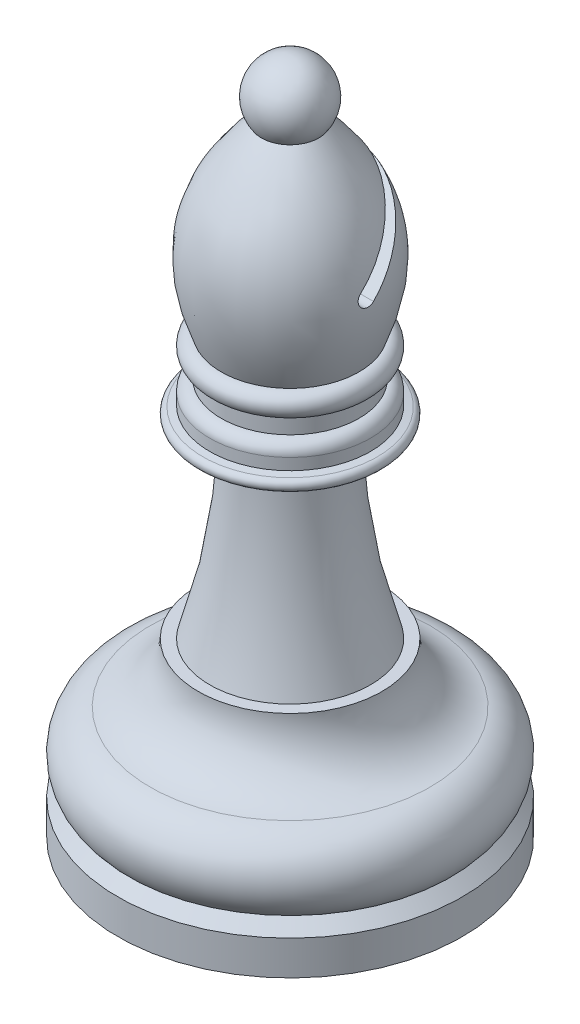
ISO-10303-21;
HEADER;
FILE_DESCRIPTION(('STEP AP214'),'2;1');
FILE_NAME('part.step','',(''),(''),'','','');
FILE_SCHEMA(('AUTOMOTIVE_DESIGN { 1 0 10303 214 1 1 1 1 }'));
ENDSEC;
DATA;
#1=APPLICATION_CONTEXT('core data for automotive mechanical design processes');
#2=APPLICATION_PROTOCOL_DEFINITION('international standard','automotive_design',2000,#1);
#3=PRODUCT_CONTEXT('',#1,'mechanical');
#4=PRODUCT('Part','Part','',(#3));
#5=PRODUCT_RELATED_PRODUCT_CATEGORY('part','',(#4));
#6=PRODUCT_DEFINITION_FORMATION('','',#4);
#7=PRODUCT_DEFINITION_CONTEXT('part definition',#1,'design');
#8=PRODUCT_DEFINITION('design','',#6,#7);
#9=PRODUCT_DEFINITION_SHAPE('','',#8);
#10=(LENGTH_UNIT() NAMED_UNIT(*) SI_UNIT(.MILLI.,.METRE.));
#11=(NAMED_UNIT(*) PLANE_ANGLE_UNIT() SI_UNIT($,.RADIAN.));
#12=(NAMED_UNIT(*) SI_UNIT($,.STERADIAN.) SOLID_ANGLE_UNIT());
#13=UNCERTAINTY_MEASURE_WITH_UNIT(LENGTH_MEASURE(1.E-05),#10,'distance_accuracy_value','');
#14=(GEOMETRIC_REPRESENTATION_CONTEXT(3) GLOBAL_UNCERTAINTY_ASSIGNED_CONTEXT((#13)) GLOBAL_UNIT_ASSIGNED_CONTEXT((#10,
#11,#12)) REPRESENTATION_CONTEXT('',''));
#15=CARTESIAN_POINT('',(0.,0.,0.));
#16=DIRECTION('',(0.,0.,1.));
#17=DIRECTION('',(1.,0.,0.));
#18=AXIS2_PLACEMENT_3D('',#15,#16,#17);
#19=CARTESIAN_POINT('',(0.,38.1,-6.));
#20=CARTESIAN_POINT('',(0.,44.6134056664983,-8.60950961383052));
#21=CARTESIAN_POINT('',(0.,49.2293830972762,-7.04536591565697));
#22=CARTESIAN_POINT('',(0.,54.,-2.5));
#23=B_SPLINE_CURVE_WITH_KNOTS('',3,(#19,#20,#21,#22),.UNSPECIFIED.,.F.,.F.,(4,4),(0.,1.),.UNSPECIFIED.);
#24=CARTESIAN_POINT('',(0.,0.,0.));
#25=DIRECTION('',(0.,-1.,0.));
#26=AXIS1_PLACEMENT('',#24,#25);
#27=SURFACE_OF_REVOLUTION('',#23,#26);
#28=CARTESIAN_POINT('',(0.,38.1,0.));
#29=DIRECTION('',(0.,-1.,0.));
#30=DIRECTION('',(0.,0.,-1.));
#31=AXIS2_PLACEMENT_3D('',#28,#29,#30);
#32=CIRCLE('',#31,6.);
#33=CARTESIAN_POINT('',(0.,38.1,-6.));
#34=VERTEX_POINT('',#33);
#35=EDGE_CURVE('E116',#34,#34,#32,.T.);
#36=ORIENTED_EDGE('',*,*,#35,.F.);
#37=EDGE_LOOP('',(#36));
#38=FACE_BOUND('',#37,.T.);
#39=CARTESIAN_POINT('',(0.,54.,0.));
#40=DIRECTION('',(0.,-1.,0.));
#41=DIRECTION('',(0.,0.,-1.));
#42=AXIS2_PLACEMENT_3D('',#39,#40,#41);
#43=CIRCLE('',#42,2.5);
#44=CARTESIAN_POINT('',(0.,54.,-2.5));
#45=VERTEX_POINT('',#44);
#46=EDGE_CURVE('E118',#45,#45,#43,.T.);
#47=ORIENTED_EDGE('',*,*,#46,.T.);
#48=EDGE_LOOP('',(#47));
#49=FACE_BOUND('',#48,.T.);
#50=CARTESIAN_POINT('',(7.26248134356405,44.0534236256244,0.));
#51=CARTESIAN_POINT('',(7.26268663383542,44.0250428411717,0.028331419455781));
#52=CARTESIAN_POINT('',(7.2625993604992,43.9990993969831,0.059088254775991));
#53=CARTESIAN_POINT('',(7.26179780040763,43.9527169371868,0.124461663837178));
#54=CARTESIAN_POINT('',(7.26108402080263,43.932273486875,0.159075095921259));
#55=CARTESIAN_POINT('',(7.25898753180029,43.8974646124223,0.231236703108871));
#56=CARTESIAN_POINT('',(7.25760450451457,43.8831020827646,0.268786265742128));
#57=CARTESIAN_POINT('',(7.25416638193759,43.8608595613702,0.345720116972008));
#58=CARTESIAN_POINT('',(7.25211141447113,43.8529783376805,0.385104055389834));
#59=CARTESIAN_POINT('',(7.24735942842652,43.8438983460937,0.464633910232364));
#60=CARTESIAN_POINT('',(7.24466180939577,43.8427058534499,0.504780506758731));
#61=CARTESIAN_POINT('',(7.23869750781927,43.847032307198,0.584668112911014));
#62=CARTESIAN_POINT('',(7.23543079735108,43.8525515829822,0.624409102534517));
#63=CARTESIAN_POINT('',(7.22842013648554,43.8701700569002,0.702566733714742));
#64=CARTESIAN_POINT('',(7.22467392792155,43.8823013366499,0.740975939002373));
#65=CARTESIAN_POINT('',(7.21685966880425,43.9128064056345,0.815191746093838));
#66=CARTESIAN_POINT('',(7.21279162702035,43.9311800248211,0.850998418761318));
#67=CARTESIAN_POINT('',(7.20447379495777,43.9737810095582,0.919233381166376));
#68=CARTESIAN_POINT('',(7.20022302991095,43.9980441465891,0.951639223091765));
#69=CARTESIAN_POINT('',(7.1917465898976,44.0516805558633,1.01190890703249));
#70=CARTESIAN_POINT('',(7.18752091612643,44.0810540695797,1.03977253430071));
#71=CARTESIAN_POINT('',(7.17926859945703,44.1441784558356,1.09023984812287));
#72=CARTESIAN_POINT('',(7.1752425397874,44.177941218614,1.112828763262));
#73=CARTESIAN_POINT('',(7.16757913028578,44.2488314962614,1.15199338980014));
#74=CARTESIAN_POINT('',(7.16394177328825,44.2859589490808,1.1685692120608));
#75=CARTESIAN_POINT('',(7.1572223757147,44.3623995012444,1.19517073644162));
#76=CARTESIAN_POINT('',(7.15413853036127,44.4017049294252,1.2052180170387));
#77=CARTESIAN_POINT('',(7.14863393273076,44.4814909415054,1.21853857435527));
#78=CARTESIAN_POINT('',(7.14621312317394,44.5219714235574,1.22181243639132));
#79=CARTESIAN_POINT('',(7.14213152634013,44.6026564791178,1.2214734863025));
#80=CARTESIAN_POINT('',(7.14046552485254,44.6428609953538,1.21790883988743));
#81=CARTESIAN_POINT('',(7.13790690272935,44.7221242377061,1.20407320865411));
#82=CARTESIAN_POINT('',(7.13701422478485,44.7611830485204,1.19380272088646));
#83=CARTESIAN_POINT('',(7.13599887231023,44.8368480551216,1.16691231879338));
#84=CARTESIAN_POINT('',(7.1358726487222,44.8734647776656,1.15032204852436));
#85=CARTESIAN_POINT('',(7.13633708154378,44.9433742202534,1.11126514820531));
#86=CARTESIAN_POINT('',(7.13692667867331,44.9766717732164,1.08880723971545));
#87=CARTESIAN_POINT('',(7.13812749857438,45.0178979654237,1.05566922974833));
#88=CARTESIAN_POINT('',(7.13845434261494,45.0277519316426,1.04729750408276));
#89=CARTESIAN_POINT('',(7.13917082058116,45.0469745631156,1.03004864288283));
#90=CARTESIAN_POINT('',(7.13956034705468,45.05634402324,1.02117238877427));
#91=CARTESIAN_POINT('',(7.1399799098201,45.0654705375734,1.01204691194898));
#92=B_SPLINE_CURVE_WITH_KNOTS('',3,(#50,#51,#52,#53,#54,#55,#56,#57,#58,#59,#60,#61,#62,#63,#64,
#65,#66,#67,#68,#69,#70,#71,#72,#73,#74,#75,#76,#77,#78,#79,#80,#81,#82,#83,#84,#85,#86,#87,#88,
#89,#90,#91),.UNSPECIFIED.,.F.,.F.,(4,2,2,2,2,2,2,2,2,2,2,2,2,2,2,2,2,2,2,2,4),(0.,
0.120146790619223,0.240196413255299,0.360303114751132,0.480386981337186,0.600583489733851,
0.720785897228578,0.841576790245981,0.962364393048281,1.08390484135041,1.20545103418418,
1.32733363124541,1.44921398107823,1.57068940836721,1.69215433806956,1.81276689302205,
1.9333705089415,2.05341524273187,2.17328254920591,2.21207154221718,2.25079473673644),.UNSPECIFIED.);
#93=CARTESIAN_POINT('',(7.26248134356405,44.0534236256244,0.));
#94=VERTEX_POINT('',#93);
#95=CARTESIAN_POINT('',(7.1399799098201,45.0654705375734,1.01204691194897));
#96=VERTEX_POINT('',#95);
#97=EDGE_CURVE('E69',#94,#96,#92,.T.);
#98=ORIENTED_EDGE('',*,*,#97,.T.);
#99=CARTESIAN_POINT('',(7.1399799098201,45.0654705375734,1.01204691194897));
#100=CARTESIAN_POINT('',(7.14838718721668,45.2475551994041,0.829962250118293));
#101=CARTESIAN_POINT('',(7.14534242337903,45.4299010166278,0.647616432894633));
#102=CARTESIAN_POINT('',(7.11650198899266,45.7936890041154,0.283828445406954));
#103=CARTESIAN_POINT('',(7.09070659768174,45.9751311854431,0.10238626407933));
#104=CARTESIAN_POINT('',(7.01655329463673,46.3355203243476,-0.258002874825186));
#105=CARTESIAN_POINT('',(6.96821670172983,46.5144694754233,-0.436952025900956));
#106=CARTESIAN_POINT('',(6.84937898158253,46.868640181314,-0.791122731791634));
#107=CARTESIAN_POINT('',(6.77887921650638,47.0438619645092,-0.966344514986769));
#108=CARTESIAN_POINT('',(6.62002788504419,47.3811919163433,-1.30367446682095));
#109=CARTESIAN_POINT('',(6.53265652269149,47.5435312986554,-1.46601384913303));
#110=CARTESIAN_POINT('',(6.33876888616723,47.8624835539578,-1.78496610443542));
#111=CARTESIAN_POINT('',(6.23224373089119,48.0190937297556,-1.94157628023319));
#112=CARTESIAN_POINT('',(6.00067312733628,48.3253831657134,-2.24786571619104));
#113=CARTESIAN_POINT('',(5.87562144586962,48.4750600708634,-2.39754262134104));
#114=CARTESIAN_POINT('',(5.60770821891917,48.7662173328409,-2.6886998833185));
#115=CARTESIAN_POINT('',(5.46484774475059,48.9076981819654,-2.83018073244301));
#116=CARTESIAN_POINT('',(5.163762225753,49.1796312267991,-3.10211377727673));
#117=CARTESIAN_POINT('',(5.00573257317453,49.3101914604504,-3.23267401092804));
#118=CARTESIAN_POINT('',(4.67367085539732,49.5607542405217,-3.48323679099935));
#119=CARTESIAN_POINT('',(4.49963741438778,49.6807558775036,-3.60323842798129));
#120=CARTESIAN_POINT('',(4.13665421465167,49.9085615176694,-3.831044068147));
#121=CARTESIAN_POINT('',(3.94772434626638,50.016381333477,-3.93886388395467));
#122=CARTESIAN_POINT('',(3.55579584794781,50.2183478423134,-4.14083039279106));
#123=CARTESIAN_POINT('',(3.35280246467963,50.3124995943304,-4.23498214480811));
#124=CARTESIAN_POINT('',(2.9891879835799,50.4626272142029,-4.38510976468059));
#125=CARTESIAN_POINT('',(2.83146415371097,50.5221308989607,-4.44461344943832));
#126=CARTESIAN_POINT('',(2.50980343241783,50.6320264906632,-4.55450904114086));
#127=CARTESIAN_POINT('',(2.34586795089689,50.682420450499,-4.60490300097666));
#128=CARTESIAN_POINT('',(2.01276179968953,50.7733467903807,-4.69582934085831));
#129=CARTESIAN_POINT('',(1.84359568198471,50.8138874873302,-4.73637003780787));
#130=CARTESIAN_POINT('',(1.5009295543641,50.8845055381128,-4.80698808859047));
#131=CARTESIAN_POINT('',(1.32742942272555,50.9145825977149,-4.8370651481926));
#132=CARTESIAN_POINT('',(0.976485697839069,50.9638449291659,-4.8863274796435));
#133=CARTESIAN_POINT('',(0.799027176707662,50.9829772436008,-4.90545979407841));
#134=CARTESIAN_POINT('',(0.442379687631089,51.0097483249955,-4.93223087547316));
#135=CARTESIAN_POINT('',(0.263190740003838,51.0173872267413,-4.93986977721893));
#136=CARTESIAN_POINT('',(-0.0954169813575829,51.0210148407701,-4.94349739124772));
#137=CARTESIAN_POINT('',(-0.274835747322854,51.0170039369948,-4.93948648747249));
#138=CARTESIAN_POINT('',(-0.632402544399132,50.9974149125931,-4.9198974630708));
#139=CARTESIAN_POINT('',(-0.810550588883745,50.9818369138855,-4.90431946436319));
#140=CARTESIAN_POINT('',(-1.15088942938791,50.9410176041595,-4.86350015463711));
#141=CARTESIAN_POINT('',(-1.31327648412099,50.9165869385956,-4.83906948907322));
#142=CARTESIAN_POINT('',(-1.63467407417452,50.8584964629644,-4.78097901344208));
#143=CARTESIAN_POINT('',(-1.79368522441342,50.8248383494822,-4.7473208999599));
#144=CARTESIAN_POINT('',(-2.10746118283643,50.7487839703908,-4.67126652086845));
#145=CARTESIAN_POINT('',(-2.26222611519591,50.7063879606197,-4.62887051109738));
#146=CARTESIAN_POINT('',(-2.5668109329149,50.6134059211095,-4.53588847158712));
#147=CARTESIAN_POINT('',(-2.71662803271197,50.5628153694881,-4.48529791996571));
#148=CARTESIAN_POINT('',(-3.17749717252343,50.3922722674444,-4.31475481792206));
#149=CARTESIAN_POINT('',(-3.47869061851698,50.258730808023,-4.18121335850069));
#150=CARTESIAN_POINT('',(-4.05095500292531,49.9625041172505,-3.8849866677281));
#151=CARTESIAN_POINT('',(-4.3219978470484,49.7997920673546,-3.72227461783221));
#152=CARTESIAN_POINT('',(-4.72425206597887,49.5235034219438,-3.44598597242149));
#153=CARTESIAN_POINT('',(-4.86653250220302,49.4178407366191,-3.34032328709671));
#154=CARTESIAN_POINT('',(-5.13927894118928,49.1993054971506,-3.12178804762825));
#155=CARTESIAN_POINT('',(-5.26975604891823,49.0864398939462,-3.00892244442382));
#156=CARTESIAN_POINT('',(-5.51869176506314,48.8541190658715,-2.7766016163491));
#157=CARTESIAN_POINT('',(-5.63713946562632,48.7346580093116,-2.65714055978927));
#158=CARTESIAN_POINT('',(-5.86150383468986,48.489947058955,-2.41242960943266));
#159=CARTESIAN_POINT('',(-5.96741680023112,48.3646954696641,-2.28717802014172));
#160=CARTESIAN_POINT('',(-6.17957294090977,48.0920490649462,-2.0145316154238));
#161=CARTESIAN_POINT('',(-6.28396671231052,47.9439327745007,-1.86641532497829));
#162=CARTESIAN_POINT('',(-6.4755236664415,47.6422282650678,-1.56471081554536));
#163=CARTESIAN_POINT('',(-6.56268580155887,47.4886397140589,-1.41112226453647));
#164=CARTESIAN_POINT('',(-6.71924972629945,47.1770416001728,-1.09952415065044));
#165=CARTESIAN_POINT('',(-6.78865631571417,47.019033244925,-0.941515795402596));
#166=CARTESIAN_POINT('',(-6.90929394128075,46.6996451608222,-0.622127711299819));
#167=CARTESIAN_POINT('',(-6.96052905917858,46.5382661977211,-0.460748748198722));
#168=CARTESIAN_POINT('',(-7.05830015864805,46.1596950068918,-0.0821775573693607));
#169=CARTESIAN_POINT('',(-7.09778094365204,45.9415601758607,0.135957273661748));
#170=CARTESIAN_POINT('',(-7.13218124919333,45.6133335387619,0.464183910760497));
#171=CARTESIAN_POINT('',(-7.13951402421507,45.5038153370225,0.573702112499927));
#172=CARTESIAN_POINT('',(-7.14593146297427,45.2846650017037,0.79285244781873));
#173=CARTESIAN_POINT('',(-7.14501664585485,45.1750328757296,0.902484573792824));
#174=CARTESIAN_POINT('',(-7.1399799098201,45.0654705375735,1.01204691194897));
#175=B_SPLINE_CURVE_WITH_KNOTS('',3,(#99,#100,#101,#102,#103,#104,#105,#106,#107,#108,#109,#110,
#111,#112,#113,#114,#115,#116,#117,#118,#119,#120,#121,#122,#123,#124,#125,#126,#127,#128,#129,
#130,#131,#132,#133,#134,#135,#136,#137,#138,#139,#140,#141,#142,#143,#144,#145,#146,#147,#148,
#149,#150,#151,#152,#153,#154,#155,#156,#157,#158,#159,#160,#161,#162,#163,#164,#165,#166,#167,
#168,#169,#170,#171,#172,#173,#174),.UNSPECIFIED.,.F.,.F.,(4,2,2,2,2,2,2,2,2,2,2,2,2,2,2,2,2,2,
2,2,2,2,2,2,2,2,2,2,2,2,2,2,2,2,2,2,2,4),(0.,0.772674150027272,1.5453388164993,2.31727419616838,
3.08916214141488,3.82523140792648,4.56164285445765,5.29830262920024,6.03491811041132,
6.76307016101677,7.49128486789059,8.21854318311233,8.94553162663503,9.48131838777722,
10.0169842575932,10.5521964020513,11.0874235951233,11.625219105941,12.163008309857,
12.7007797900976,13.2385456022303,13.7360564854443,14.2334759561565,14.7308808649165,
15.2285611908109,16.2907247576756,17.3538699001878,17.972341180176,18.5902243947428,
19.2086629738765,19.8272837959143,20.5286205296306,21.2299998886421,21.9311894455125,
22.6322213985798,23.5632247857868,24.0282077397182,24.4931614255902),.UNSPECIFIED.);
#176=CARTESIAN_POINT('',(-7.1399799098201,45.0654705375734,1.01204691194897));
#177=VERTEX_POINT('',#176);
#178=EDGE_CURVE('E11',#96,#177,#175,.T.);
#179=ORIENTED_EDGE('',*,*,#178,.T.);
#180=CARTESIAN_POINT('',(-7.1399799098201,45.0654705375734,1.01204691194897));
#181=CARTESIAN_POINT('',(-7.13867375830709,45.0371873836789,1.04037931057469));
#182=CARTESIAN_POINT('',(-7.13766473670743,45.0064799766659,1.06628956786351));
#183=CARTESIAN_POINT('',(-7.1363128017723,44.9411964267878,1.11263262541485));
#184=CARTESIAN_POINT('',(-7.1359694164194,44.9066230437867,1.13306929824798));
#185=CARTESIAN_POINT('',(-7.13601856049852,44.8345249992075,1.16788335785369));
#186=CARTESIAN_POINT('',(-7.13641148762617,44.7969987532229,1.18225746498806));
#187=CARTESIAN_POINT('',(-7.1379634388319,44.7200968902574,1.20453069009065));
#188=CARTESIAN_POINT('',(-7.13912228822421,44.6807216968722,1.21243128356902));
#189=CARTESIAN_POINT('',(-7.14219542962653,44.601268101322,1.22154309436843));
#190=CARTESIAN_POINT('',(-7.1441090805431,44.5611903234318,1.22275997546805));
#191=CARTESIAN_POINT('',(-7.14863965556428,44.4814314331836,1.2185036534181));
#192=CARTESIAN_POINT('',(-7.15125660988467,44.4417503379443,1.21303016279656));
#193=CARTESIAN_POINT('',(-7.15711135325733,44.3637576494735,1.19553636201952));
#194=CARTESIAN_POINT('',(-7.16035131925842,44.3254514344164,1.18349281516681));
#195=CARTESIAN_POINT('',(-7.16731623473637,44.2514257762034,1.15320330584934));
#196=CARTESIAN_POINT('',(-7.17104117045811,44.2157062597262,1.13495751927386));
#197=CARTESIAN_POINT('',(-7.17884661706416,44.1475956320092,1.09263795243648));
#198=CARTESIAN_POINT('',(-7.1829294403293,44.1152296440409,1.06852416231802));
#199=CARTESIAN_POINT('',(-7.19125027691519,44.055011115354,1.01521982597433));
#200=CARTESIAN_POINT('',(-7.19548829964669,44.027158848889,0.986028971490171));
#201=CARTESIAN_POINT('',(-7.20395850146631,43.9766053625575,0.923215322081625));
#202=CARTESIAN_POINT('',(-7.20819052308163,43.9539330164453,0.889569260284869));
#203=CARTESIAN_POINT('',(-7.21644399471168,43.9145799076678,0.818914770803875));
#204=CARTESIAN_POINT('',(-7.22046544473242,43.8978991448313,0.781906343215806));
#205=CARTESIAN_POINT('',(-7.22813280492595,43.8710182342581,0.70557782688519));
#206=CARTESIAN_POINT('',(-7.23177879780943,43.8608166566305,0.666258250284131));
#207=CARTESIAN_POINT('',(-7.23855927232342,43.8472002309236,0.58641953473591));
#208=CARTESIAN_POINT('',(-7.24169379172475,43.843784881493,0.545900484627662));
#209=CARTESIAN_POINT('',(-7.24733516756646,43.8438592241276,0.465041392184652));
#210=CARTESIAN_POINT('',(-7.24984526869875,43.8473123446094,0.424701541875099));
#211=CARTESIAN_POINT('',(-7.25419885472545,43.8609730595179,0.345145384704932));
#212=CARTESIAN_POINT('',(-7.25604239470537,43.8711800955946,0.30592898524757));
#213=CARTESIAN_POINT('',(-7.25903524219555,43.8979922997472,0.229957151990089));
#214=CARTESIAN_POINT('',(-7.26018809596523,43.9145640554558,0.193190023869726));
#215=CARTESIAN_POINT('',(-7.26183003806275,43.9536384923244,0.122977301401444));
#216=CARTESIAN_POINT('',(-7.26232011711179,43.9761322609406,0.0895268188254094));
#217=CARTESIAN_POINT('',(-7.26256299464039,44.0094001519591,0.0480504453189118));
#218=CARTESIAN_POINT('',(-7.26259013326639,44.0178441648932,0.0380955226001134));
#219=CARTESIAN_POINT('',(-7.26258187521037,44.035249019076,0.0186785597922273));
#220=CARTESIAN_POINT('',(-7.26254658413436,44.0442089627778,0.00921571517214043));
#221=CARTESIAN_POINT('',(-7.26248134356405,44.0534236256244,0.));
#222=B_SPLINE_CURVE_WITH_KNOTS('',3,(#180,#181,#182,#183,#184,#185,#186,#187,#188,#189,#190,
#191,#192,#193,#194,#195,#196,#197,#198,#199,#200,#201,#202,#203,#204,#205,#206,#207,#208,#209,
#210,#211,#212,#213,#214,#215,#216,#217,#218,#219,#220,#221),.UNSPECIFIED.,.F.,.F.,(4,2,2,2,2,2,
2,2,2,2,2,2,2,2,2,2,2,2,2,2,4),(0.,0.120007437315835,0.239929743520045,0.359916840591081,
0.479876581348775,0.59973465250772,0.719597873911052,0.839887797120201,0.960174309312853,
1.0813051572738,1.20244336238195,1.32424117702637,1.44603898818716,1.56780991044869,
1.6895718362106,1.81068716869586,1.93179248975782,2.05227055667731,2.17256833217398,
2.21171579517939,2.25079709968755),.UNSPECIFIED.);
#223=CARTESIAN_POINT('',(-7.26248134356405,44.0534236256244,0.));
#224=VERTEX_POINT('',#223);
#225=EDGE_CURVE('E46',#177,#224,#222,.T.);
#226=ORIENTED_EDGE('',*,*,#225,.T.);
#227=CARTESIAN_POINT('',(-7.26248134356405,44.0534236256244,0.));
#228=CARTESIAN_POINT('',(-7.261156953543,44.2457939440137,-0.19237031838932));
#229=CARTESIAN_POINT('',(-7.24744322879306,44.4381406156728,-0.384716990048377));
#230=CARTESIAN_POINT('',(-7.19517968497103,44.8212035764886,-0.767779950864221));
#231=CARTESIAN_POINT('',(-7.15662128451786,45.0119192792353,-0.958495653610856));
#232=CARTESIAN_POINT('',(-7.05457574782816,45.3901356300726,-1.33671200444817));
#233=CARTESIAN_POINT('',(-6.99107100539621,45.5776339096711,-1.5242102840467));
#234=CARTESIAN_POINT('',(-6.83939496446886,45.9475431290452,-1.89411950342079));
#235=CARTESIAN_POINT('',(-6.75122898007587,46.1299551555248,-2.07653152990036));
#236=CARTESIAN_POINT('',(-6.55985558656999,46.4716748069271,-2.4182511813027));
#237=CARTESIAN_POINT('',(-6.4587516050055,46.631572895905,-2.5781492702806));
#238=CARTESIAN_POINT('',(-6.23704193726552,46.9445389285707,-2.89111530294627));
#239=CARTESIAN_POINT('',(-6.11642981137006,47.0976045954846,-3.04418096986025));
#240=CARTESIAN_POINT('',(-5.85649062893772,47.3954025115118,-3.34197888588735));
#241=CARTESIAN_POINT('',(-5.71717931974984,47.5401416278028,-3.48671800217839));
#242=CARTESIAN_POINT('',(-5.42054649999131,47.8200728103777,-3.76664918475331));
#243=CARTESIAN_POINT('',(-5.26322683276622,47.9552658515167,-3.90184222589232));
#244=CARTESIAN_POINT('',(-4.94025672105069,48.2078530173603,-4.15442939173591));
#245=CARTESIAN_POINT('',(-4.77548745435735,48.3258104120274,-4.27238678640296));
#246=CARTESIAN_POINT('',(-4.43156800642927,48.5506300415713,-4.49720641594687));
#247=CARTESIAN_POINT('',(-4.25242498893377,48.6574977432834,-4.60407411765905));
#248=CARTESIAN_POINT('',(-3.88076284262928,48.8588919303423,-4.80546830471789));
#249=CARTESIAN_POINT('',(-3.68824485878692,48.9534194700813,-4.89999584445689));
#250=CARTESIAN_POINT('',(-3.29111120689039,49.1287869816479,-5.07536335602351));
#251=CARTESIAN_POINT('',(-3.08649713157591,49.2096287501424,-5.156205124518));
#252=CARTESIAN_POINT('',(-2.6873601299082,49.3490775853464,-5.29565395972203));
#253=CARTESIAN_POINT('',(-2.49381719717433,49.4090880581805,-5.35566443255616));
#254=CARTESIAN_POINT('',(-2.09960157255525,49.5159322284677,-5.46250860284336));
#255=CARTESIAN_POINT('',(-1.89893022365138,49.5627683932643,-5.5093447676399));
#256=CARTESIAN_POINT('',(-1.49230800805119,49.6424012903131,-5.5889776646887));
#257=CARTESIAN_POINT('',(-1.28636298100084,49.6752128954304,-5.62178926980602));
#258=CARTESIAN_POINT('',(-0.870888385840316,49.7262259178072,-5.67280229218278));
#259=CARTESIAN_POINT('',(-0.661359272811073,49.7444291760685,-5.69100555044411));
#260=CARTESIAN_POINT('',(-0.267218112922337,49.7645114367281,-5.71108781110378));
#261=CARTESIAN_POINT('',(-0.08278177966257,49.7681535602772,-5.71472993465279));
#262=CARTESIAN_POINT('',(0.285815851486273,49.7639327760944,-5.71050915047006));
#263=CARTESIAN_POINT('',(0.469977175121741,49.7560710230439,-5.70264739741954));
#264=CARTESIAN_POINT('',(0.836600129371235,49.7289711457949,-5.67554752017055));
#265=CARTESIAN_POINT('',(1.01906185740748,49.7097336777888,-5.65631005216443));
#266=CARTESIAN_POINT('',(1.38094916443063,49.6601835385089,-5.60675991288458));
#267=CARTESIAN_POINT('',(1.56037470074185,49.6298707116988,-5.57644708607438));
#268=CARTESIAN_POINT('',(1.90862206361809,49.5598873689602,-5.5064637433358));
#269=CARTESIAN_POINT('',(2.07759393821511,49.5205886543813,-5.46716502875697));
#270=CARTESIAN_POINT('',(2.4106244053921,49.4325873189082,-5.3791636932838));
#271=CARTESIAN_POINT('',(2.57468128138639,49.3838814557497,-5.33045783012528));
#272=CARTESIAN_POINT('',(2.89692677262425,49.2776398557391,-5.22421623011473));
#273=CARTESIAN_POINT('',(3.05511642555276,49.2201056896086,-5.1666820639842));
#274=CARTESIAN_POINT('',(3.36497402134808,49.0967660235607,-5.04334239793628));
#275=CARTESIAN_POINT('',(3.51663946060878,49.0309573857306,-4.97753376010618));
#276=CARTESIAN_POINT('',(3.82505138324108,48.8858955234895,-4.8324718978651));
#277=CARTESIAN_POINT('',(3.98117476358064,48.8059797532853,-4.75255612766093));
#278=CARTESIAN_POINT('',(4.28432108796205,48.6378821554991,-4.58445852987475));
#279=CARTESIAN_POINT('',(4.43134081817665,48.549697436074,-4.49627381044962));
#280=CARTESIAN_POINT('',(4.71565244444057,48.3657989790361,-4.31237535341168));
#281=CARTESIAN_POINT('',(4.85294353119668,48.2700846164518,-4.21666099082739));
#282=CARTESIAN_POINT('',(5.11728355230691,48.0718240000323,-4.01840037440792));
#283=CARTESIAN_POINT('',(5.24433161477954,47.9692771659744,-3.91585354034997));
#284=CARTESIAN_POINT('',(5.50232930395019,47.745350814125,-3.69192718850058));
#285=CARTESIAN_POINT('',(5.63192035207153,47.6231874571075,-3.56976383148307));
#286=CARTESIAN_POINT('',(5.87709602072111,47.3720733180356,-3.31864969241122));
#287=CARTESIAN_POINT('',(5.99268351930972,47.2431239385103,-3.18970031288591));
#288=CARTESIAN_POINT('',(6.20950843401965,46.9791667683822,-2.92574314275781));
#289=CARTESIAN_POINT('',(6.31073214808301,46.8441533525673,-2.79072972694294));
#290=CARTESIAN_POINT('',(6.49825783026449,46.5690958347483,-2.51567220912392));
#291=CARTESIAN_POINT('',(6.58456407048134,46.4290531869487,-2.37562956132434));
#292=CARTESIAN_POINT('',(6.74868128101774,46.1326154116195,-2.07919178599508));
#293=CARTESIAN_POINT('',(6.82513830569203,45.9758448117443,-1.92242118611986));
#294=CARTESIAN_POINT('',(6.95979449349066,45.6584841701556,-1.60506054453122));
#295=CARTESIAN_POINT('',(7.01799872470667,45.4978952020015,-1.44447157637711));
#296=CARTESIAN_POINT('',(7.11593963629262,45.1741539762573,-1.1207303506329));
#297=CARTESIAN_POINT('',(7.15570018362417,45.0110053154249,-0.957581689800517));
#298=CARTESIAN_POINT('',(7.21680453518986,44.6830606450617,-0.629637019437316));
#299=CARTESIAN_POINT('',(7.2381583092719,44.5182655762867,-0.464841950662278));
#300=CARTESIAN_POINT('',(7.25405191393543,44.3032372028897,-0.249813577265263));
#301=CARTESIAN_POINT('',(7.25690587837342,44.2532649720721,-0.199841346447695));
#302=CARTESIAN_POINT('',(7.26094244865156,44.1533388205656,-0.0999151949412021));
#303=CARTESIAN_POINT('',(7.26212679151275,44.1033849349816,-0.0499613093572059));
#304=CARTESIAN_POINT('',(7.26248134356405,44.0534236256244,0.));
#305=B_SPLINE_CURVE_WITH_KNOTS('',3,(#227,#228,#229,#230,#231,#232,#233,#234,#235,#236,#237,
#238,#239,#240,#241,#242,#243,#244,#245,#246,#247,#248,#249,#250,#251,#252,#253,#254,#255,#256,
#257,#258,#259,#260,#261,#262,#263,#264,#265,#266,#267,#268,#269,#270,#271,#272,#273,#274,#275,
#276,#277,#278,#279,#280,#281,#282,#283,#284,#285,#286,#287,#288,#289,#290,#291,#292,#293,#294,
#295,#296,#297,#298,#299,#300,#301,#302,#303,#304),.UNSPECIFIED.,.F.,.F.,(4,2,2,2,2,2,2,2,2,2,2,
2,2,2,2,2,2,2,2,2,2,2,2,2,2,2,2,2,2,2,2,2,2,2,2,2,2,2,4),(0.,0.815930706653806,1.63214338794526,
2.4489331595795,3.26554706151804,4.00772948671276,4.75015741133353,5.49196398442111,
6.23369469355975,6.93618087683552,7.63831909693415,8.34039728423997,9.04238323118829,
9.67548545774812,10.3084690350183,10.9407796657562,11.5730105976781,12.1258356074405,
12.6786051321784,13.2313427742825,13.7840881790391,14.3171438315935,14.850383535815,
15.3835284764127,15.9168762138609,16.494491985559,17.072310521688,17.6501770683113,
18.2280927508496,18.875299042414,19.5223720913231,20.1700583123612,20.8175587391649,
21.5203279541628,22.2229018643256,22.9245640582002,23.625845964403,23.8380197822748,
24.0499726979618),.UNSPECIFIED.);
#306=EDGE_CURVE('E65',#224,#94,#305,.T.);
#307=ORIENTED_EDGE('',*,*,#306,.T.);
#308=EDGE_LOOP('',(#98,#179,#226,#307));
#309=FACE_BOUND('',#308,.T.);
#310=ADVANCED_FACE('F33',(#38,#49,#309),#27,.F.);
#311=CARTESIAN_POINT('',(0.,0.,0.));
#312=DIRECTION('',(0.,-1.,0.));
#313=DIRECTION('',(0.,0.,-1.));
#314=AXIS2_PLACEMENT_3D('',#311,#312,#313);
#315=PLANE('',#314);
#316=CARTESIAN_POINT('',(0.,0.,0.));
#317=DIRECTION('',(0.,-1.,0.));
#318=DIRECTION('',(0.,0.,-1.));
#319=AXIS2_PLACEMENT_3D('',#316,#317,#318);
#320=CIRCLE('',#319,15.);
#321=CARTESIAN_POINT('',(0.,0.,-15.));
#322=VERTEX_POINT('',#321);
#323=EDGE_CURVE('E70',#322,#322,#320,.T.);
#324=ORIENTED_EDGE('',*,*,#323,.T.);
#325=EDGE_LOOP('',(#324));
#326=FACE_BOUND('',#325,.T.);
#327=ADVANCED_FACE('F35',(#326),#315,.T.);
#328=CARTESIAN_POINT('',(0.,0.,0.));
#329=DIRECTION('',(0.,-1.,0.));
#330=DIRECTION('',(0.,0.,-1.));
#331=AXIS2_PLACEMENT_3D('',#328,#329,#330);
#332=CYLINDRICAL_SURFACE('',#331,15.);
#333=CARTESIAN_POINT('',(0.,3.,0.));
#334=DIRECTION('',(0.,-1.,0.));
#335=DIRECTION('',(0.,0.,-1.));
#336=AXIS2_PLACEMENT_3D('',#333,#334,#335);
#337=CIRCLE('',#336,15.);
#338=CARTESIAN_POINT('',(0.,3.,-15.));
#339=VERTEX_POINT('',#338);
#340=EDGE_CURVE('E159',#339,#339,#337,.T.);
#341=ORIENTED_EDGE('',*,*,#340,.T.);
#342=EDGE_LOOP('',(#341));
#343=FACE_BOUND('',#342,.T.);
#344=ORIENTED_EDGE('',*,*,#323,.F.);
#345=EDGE_LOOP('',(#344));
#346=FACE_BOUND('',#345,.T.);
#347=ADVANCED_FACE('F111',(#343,#346),#332,.T.);
#348=CARTESIAN_POINT('',(0.,3.,0.));
#349=DIRECTION('',(0.,-1.,0.));
#350=DIRECTION('',(0.,0.,-1.));
#351=AXIS2_PLACEMENT_3D('',#348,#349,#350);
#352=CONICAL_SURFACE('',#351,15.,0.78539816339745);
#353=CARTESIAN_POINT('',(0.,4.,0.));
#354=DIRECTION('',(0.,-1.,0.));
#355=DIRECTION('',(0.,0.,-1.));
#356=AXIS2_PLACEMENT_3D('',#353,#354,#355);
#357=CIRCLE('',#356,14.);
#358=CARTESIAN_POINT('',(0.,4.,-14.));
#359=VERTEX_POINT('',#358);
#360=EDGE_CURVE('E156',#359,#359,#357,.T.);
#361=ORIENTED_EDGE('',*,*,#360,.T.);
#362=EDGE_LOOP('',(#361));
#363=FACE_BOUND('',#362,.T.);
#364=ORIENTED_EDGE('',*,*,#340,.F.);
#365=EDGE_LOOP('',(#364));
#366=FACE_BOUND('',#365,.T.);
#367=ADVANCED_FACE('F169',(#363,#366),#352,.T.);
#368=CARTESIAN_POINT('',(0.,6.44948974278318,0.));
#369=DIRECTION('',(0.,-1.,0.));
#370=DIRECTION('',(0.,0.,-1.));
#371=AXIS2_PLACEMENT_3D('',#368,#369,#370);
#372=TOROIDAL_SURFACE('',#371,11.5,3.5);
#373=CARTESIAN_POINT('',(0.,9.88058299684989,0.));
#374=DIRECTION('',(0.,-1.,0.));
#375=DIRECTION('',(0.,0.,-1.));
#376=AXIS2_PLACEMENT_3D('',#373,#374,#375);
#377=CIRCLE('',#376,12.1910854374807);
#378=CARTESIAN_POINT('',(0.,9.88058299684989,-12.1910854374807));
#379=VERTEX_POINT('',#378);
#380=EDGE_CURVE('E153',#379,#379,#377,.T.);
#381=ORIENTED_EDGE('',*,*,#380,.T.);
#382=EDGE_LOOP('',(#381));
#383=FACE_BOUND('',#382,.T.);
#384=ORIENTED_EDGE('',*,*,#360,.F.);
#385=EDGE_LOOP('',(#384));
#386=FACE_BOUND('',#385,.T.);
#387=ADVANCED_FACE('F174',(#383,#386),#372,.T.);
#388=CARTESIAN_POINT('',(0.,15.,0.));
#389=DIRECTION('',(0.,-1.,0.));
#390=DIRECTION('',(0.,0.,-1.));
#391=AXIS2_PLACEMENT_3D('',#388,#389,#390);
#392=TOROIDAL_SURFACE('',#391,13.2222304041979,5.22223040419786);
#393=CARTESIAN_POINT('',(0.,15.,0.));
#394=DIRECTION('',(0.,-1.,0.));
#395=DIRECTION('',(0.,0.,-1.));
#396=AXIS2_PLACEMENT_3D('',#393,#394,#395);
#397=CIRCLE('',#396,8.);
#398=CARTESIAN_POINT('',(0.,15.,-8.));
#399=VERTEX_POINT('',#398);
#400=EDGE_CURVE('E150',#399,#399,#397,.T.);
#401=ORIENTED_EDGE('',*,*,#400,.T.);
#402=EDGE_LOOP('',(#401));
#403=FACE_BOUND('',#402,.T.);
#404=ORIENTED_EDGE('',*,*,#380,.F.);
#405=EDGE_LOOP('',(#404));
#406=FACE_BOUND('',#405,.T.);
#407=ADVANCED_FACE('F180',(#403,#406),#392,.F.);
#408=CARTESIAN_POINT('',(0.,15.,-8.));
#409=DIRECTION('',(0.,1.,0.));
#410=DIRECTION('',(0.,0.,1.));
#411=AXIS2_PLACEMENT_3D('',#408,#409,#410);
#412=PLANE('',#411);
#413=CARTESIAN_POINT('',(0.,15.,0.));
#414=DIRECTION('',(0.,-1.,0.));
#415=DIRECTION('',(0.,0.,-1.));
#416=AXIS2_PLACEMENT_3D('',#413,#414,#415);
#417=CIRCLE('',#416,6.99999999999998);
#418=CARTESIAN_POINT('',(0.,15.,-6.99999999999998));
#419=VERTEX_POINT('',#418);
#420=EDGE_CURVE('E147',#419,#419,#417,.T.);
#421=ORIENTED_EDGE('',*,*,#420,.T.);
#422=EDGE_LOOP('',(#421));
#423=FACE_BOUND('',#422,.T.);
#424=ORIENTED_EDGE('',*,*,#400,.F.);
#425=EDGE_LOOP('',(#424));
#426=FACE_BOUND('',#425,.T.);
#427=ADVANCED_FACE('F184',(#423,#426),#412,.T.);
#428=CARTESIAN_POINT('',(0.,31.,0.));
#429=DIRECTION('',(0.,-1.,0.));
#430=DIRECTION('',(0.,0.,-1.));
#431=AXIS2_PLACEMENT_3D('',#428,#429,#430);
#432=TOROIDAL_SURFACE('',#431,56.95,52.45);
#433=CARTESIAN_POINT('',(0.,30.9999999999996,0.));
#434=DIRECTION('',(0.,-1.,0.));
#435=DIRECTION('',(0.,0.,-1.));
#436=AXIS2_PLACEMENT_3D('',#433,#434,#435);
#437=CIRCLE('',#436,4.49999999999999);
#438=CARTESIAN_POINT('',(0.,30.9999999999996,-4.49999999999999));
#439=VERTEX_POINT('',#438);
#440=EDGE_CURVE('E144',#439,#439,#437,.T.);
#441=ORIENTED_EDGE('',*,*,#440,.T.);
#442=EDGE_LOOP('',(#441));
#443=FACE_BOUND('',#442,.T.);
#444=ORIENTED_EDGE('',*,*,#420,.F.);
#445=EDGE_LOOP('',(#444));
#446=FACE_BOUND('',#445,.T.);
#447=ADVANCED_FACE('F188',(#443,#446),#432,.F.);
#448=CARTESIAN_POINT('',(0.,30.9999999999996,0.));
#449=DIRECTION('',(0.,1.,0.));
#450=DIRECTION('',(0.,0.,1.));
#451=AXIS2_PLACEMENT_3D('',#448,#449,#450);
#452=CONICAL_SURFACE('',#451,4.49999999999999,1.4078259870439);
#453=CARTESIAN_POINT('',(0.,31.5066251501201,0.));
#454=DIRECTION('',(0.,-1.,0.));
#455=DIRECTION('',(0.,0.,-1.));
#456=AXIS2_PLACEMENT_3D('',#453,#454,#455);
#457=CIRCLE('',#456,7.58112494995996);
#458=CARTESIAN_POINT('',(0.,31.5066251501201,-7.58112494995996));
#459=VERTEX_POINT('',#458);
#460=EDGE_CURVE('E141',#459,#459,#457,.T.);
#461=ORIENTED_EDGE('',*,*,#460,.T.);
#462=EDGE_LOOP('',(#461));
#463=FACE_BOUND('',#462,.T.);
#464=ORIENTED_EDGE('',*,*,#440,.F.);
#465=EDGE_LOOP('',(#464));
#466=FACE_BOUND('',#465,.T.);
#467=ADVANCED_FACE('F192',(#463,#466),#452,.T.);
#468=CARTESIAN_POINT('',(0.,32.,0.));
#469=DIRECTION('',(0.,-1.,0.));
#470=DIRECTION('',(0.,0.,-1.));
#471=AXIS2_PLACEMENT_3D('',#468,#469,#470);
#472=TOROIDAL_SURFACE('',#471,7.5,0.500000000000006);
#473=CARTESIAN_POINT('',(0.,32.4918032786885,0.));
#474=DIRECTION('',(0.,-1.,0.));
#475=DIRECTION('',(0.,0.,-1.));
#476=AXIS2_PLACEMENT_3D('',#473,#474,#475);
#477=CIRCLE('',#476,7.59016393442623);
#478=CARTESIAN_POINT('',(0.,32.4918032786885,-7.59016393442623));
#479=VERTEX_POINT('',#478);
#480=EDGE_CURVE('E138',#479,#479,#477,.T.);
#481=ORIENTED_EDGE('',*,*,#480,.T.);
#482=EDGE_LOOP('',(#481));
#483=FACE_BOUND('',#482,.T.);
#484=ORIENTED_EDGE('',*,*,#460,.F.);
#485=EDGE_LOOP('',(#484));
#486=FACE_BOUND('',#485,.T.);
#487=ADVANCED_FACE('F196',(#483,#486),#472,.T.);
#488=CARTESIAN_POINT('',(0.,32.4918032786885,0.));
#489=DIRECTION('',(0.,-1.,0.));
#490=DIRECTION('',(0.,0.,-1.));
#491=AXIS2_PLACEMENT_3D('',#488,#489,#490);
#492=CONICAL_SURFACE('',#491,7.59016393442623,1.38947655239341);
#493=CARTESIAN_POINT('',(0.,32.6,0.));
#494=DIRECTION('',(0.,-1.,0.));
#495=DIRECTION('',(0.,0.,-1.));
#496=AXIS2_PLACEMENT_3D('',#493,#494,#495);
#497=CIRCLE('',#496,7.);
#498=CARTESIAN_POINT('',(0.,32.6,-7.));
#499=VERTEX_POINT('',#498);
#500=EDGE_CURVE('E135',#499,#499,#497,.T.);
#501=ORIENTED_EDGE('',*,*,#500,.T.);
#502=EDGE_LOOP('',(#501));
#503=FACE_BOUND('',#502,.T.);
#504=ORIENTED_EDGE('',*,*,#480,.F.);
#505=EDGE_LOOP('',(#504));
#506=FACE_BOUND('',#505,.T.);
#507=ADVANCED_FACE('F200',(#503,#506),#492,.T.);
#508=CARTESIAN_POINT('',(0.,0.,0.));
#509=DIRECTION('',(0.,-1.,0.));
#510=DIRECTION('',(0.,0.,-1.));
#511=AXIS2_PLACEMENT_3D('',#508,#509,#510);
#512=CYLINDRICAL_SURFACE('',#511,7.);
#513=CARTESIAN_POINT('',(0.,33.6,0.));
#514=DIRECTION('',(0.,-1.,0.));
#515=DIRECTION('',(0.,0.,-1.));
#516=AXIS2_PLACEMENT_3D('',#513,#514,#515);
#517=CIRCLE('',#516,7.);
#518=CARTESIAN_POINT('',(0.,33.6,-7.));
#519=VERTEX_POINT('',#518);
#520=EDGE_CURVE('E132',#519,#519,#517,.T.);
#521=ORIENTED_EDGE('',*,*,#520,.T.);
#522=EDGE_LOOP('',(#521));
#523=FACE_BOUND('',#522,.T.);
#524=ORIENTED_EDGE('',*,*,#500,.F.);
#525=EDGE_LOOP('',(#524));
#526=FACE_BOUND('',#525,.T.);
#527=ADVANCED_FACE('F204',(#523,#526),#512,.T.);
#528=CARTESIAN_POINT('',(0.,33.6,0.));
#529=DIRECTION('',(0.,-1.,0.));
#530=DIRECTION('',(0.,0.,-1.));
#531=AXIS2_PLACEMENT_3D('',#528,#529,#530);
#532=TOROIDAL_SURFACE('',#531,6.,1.);
#533=CARTESIAN_POINT('',(0.,34.6,0.));
#534=DIRECTION('',(0.,-1.,0.));
#535=DIRECTION('',(0.,0.,-1.));
#536=AXIS2_PLACEMENT_3D('',#533,#534,#535);
#537=CIRCLE('',#536,6.);
#538=CARTESIAN_POINT('',(0.,34.6,-6.));
#539=VERTEX_POINT('',#538);
#540=EDGE_CURVE('E129',#539,#539,#537,.T.);
#541=ORIENTED_EDGE('',*,*,#540,.T.);
#542=EDGE_LOOP('',(#541));
#543=FACE_BOUND('',#542,.T.);
#544=ORIENTED_EDGE('',*,*,#520,.F.);
#545=EDGE_LOOP('',(#544));
#546=FACE_BOUND('',#545,.T.);
#547=ADVANCED_FACE('F208',(#543,#546),#532,.T.);
#548=CARTESIAN_POINT('',(0.,0.,0.));
#549=DIRECTION('',(0.,-1.,0.));
#550=DIRECTION('',(0.,0.,-1.));
#551=AXIS2_PLACEMENT_3D('',#548,#549,#550);
#552=CYLINDRICAL_SURFACE('',#551,6.);
#553=CARTESIAN_POINT('',(0.,36.1,0.));
#554=DIRECTION('',(0.,-1.,0.));
#555=DIRECTION('',(0.,0.,-1.));
#556=AXIS2_PLACEMENT_3D('',#553,#554,#555);
#557=CIRCLE('',#556,6.);
#558=CARTESIAN_POINT('',(0.,36.1,-6.));
#559=VERTEX_POINT('',#558);
#560=EDGE_CURVE('E120',#559,#559,#557,.T.);
#561=ORIENTED_EDGE('',*,*,#560,.T.);
#562=EDGE_LOOP('',(#561));
#563=FACE_BOUND('',#562,.T.);
#564=ORIENTED_EDGE('',*,*,#540,.F.);
#565=EDGE_LOOP('',(#564));
#566=FACE_BOUND('',#565,.T.);
#567=ADVANCED_FACE('F103',(#563,#566),#552,.T.);
#568=CARTESIAN_POINT('',(0.,37.1,0.));
#569=DIRECTION('',(0.,-1.,0.));
#570=DIRECTION('',(0.,0.,-1.));
#571=AXIS2_PLACEMENT_3D('',#568,#569,#570);
#572=TOROIDAL_SURFACE('',#571,6.,1.);
#573=ORIENTED_EDGE('',*,*,#35,.T.);
#574=EDGE_LOOP('',(#573));
#575=FACE_BOUND('',#574,.T.);
#576=ORIENTED_EDGE('',*,*,#560,.F.);
#577=EDGE_LOOP('',(#576));
#578=FACE_BOUND('',#577,.T.);
#579=ADVANCED_FACE('F98',(#575,#578),#572,.T.);
#580=CARTESIAN_POINT('',(0.,55.875,0.));
#581=DIRECTION('',(0.,-1.,0.));
#582=DIRECTION('',(0.,0.,-1.));
#583=AXIS2_PLACEMENT_3D('',#580,#581,#582);
#584=SPHERICAL_SURFACE('',#583,3.125);
#585=ORIENTED_EDGE('',*,*,#46,.F.);
#586=EDGE_LOOP('',(#585));
#587=FACE_BOUND('',#586,.T.);
#588=ADVANCED_FACE('F95',(#587),#584,.T.);
#589=CARTESIAN_POINT('',(10.,51.2178854207268,-5.14036797120449));
#590=DIRECTION('',(0.,-0.707106781186551,-0.707106781186544));
#591=DIRECTION('',(0.,0.707106781186544,-0.707106781186551));
#592=AXIS2_PLACEMENT_3D('',#589,#590,#591);
#593=PLANE('',#592);
#594=DIRECTION('',(-1.,0.,0.));
#595=VECTOR('',#594,1.);
#596=CARTESIAN_POINT('',(10.,45.0654705375734,1.01204691194897));
#597=LINE('',#596,#595);
#598=EDGE_CURVE('E73',#96,#177,#597,.T.);
#599=ORIENTED_EDGE('',*,*,#598,.T.);
#600=ORIENTED_EDGE('',*,*,#178,.F.);
#601=EDGE_LOOP('',(#599,#600));
#602=FACE_BOUND('',#601,.T.);
#603=ADVANCED_FACE('F90',(#602),#593,.T.);
#604=CARTESIAN_POINT('',(10.,44.5594470815989,0.506023455974483));
#605=DIRECTION('',(-1.,0.,0.));
#606=DIRECTION('',(0.,0.,1.));
#607=AXIS2_PLACEMENT_3D('',#604,#605,#606);
#608=CYLINDRICAL_SURFACE('',#607,0.715625234318034);
#609=ORIENTED_EDGE('',*,*,#598,.F.);
#610=ORIENTED_EDGE('',*,*,#97,.F.);
#611=DIRECTION('',(-1.,0.,0.));
#612=VECTOR('',#611,1.);
#613=CARTESIAN_POINT('',(10.,44.0534236256244,0.));
#614=LINE('',#613,#612);
#615=EDGE_CURVE('E52',#94,#224,#614,.T.);
#616=ORIENTED_EDGE('',*,*,#615,.T.);
#617=ORIENTED_EDGE('',*,*,#225,.F.);
#618=EDGE_LOOP('',(#609,#610,#616,#617));
#619=FACE_BOUND('',#618,.T.);
#620=ADVANCED_FACE('F72',(#619),#608,.F.);
#621=CARTESIAN_POINT('',(10.,50.2058385087779,-6.15241488315348));
#622=DIRECTION('',(0.,0.707106781186551,0.707106781186544));
#623=DIRECTION('',(0.,-0.707106781186544,0.707106781186551));
#624=AXIS2_PLACEMENT_3D('',#621,#622,#623);
#625=PLANE('',#624);
#626=ORIENTED_EDGE('',*,*,#615,.F.);
#627=ORIENTED_EDGE('',*,*,#306,.F.);
#628=EDGE_LOOP('',(#626,#627));
#629=FACE_BOUND('',#628,.T.);
#630=ADVANCED_FACE('F66',(#629),#625,.T.);
#631=CLOSED_SHELL('',(#310,#327,#347,#367,#387,#407,#427,#447,#467,#487,#507,#527,#547,#567,
#579,#588,#603,#620,#630));
#632=MANIFOLD_SOLID_BREP('B2',#631);
#633=ADVANCED_BREP_SHAPE_REPRESENTATION('',(#18,#632),#14);
#634=SHAPE_DEFINITION_REPRESENTATION(#9,#633);
ENDSEC;
END-ISO-10303-21;
